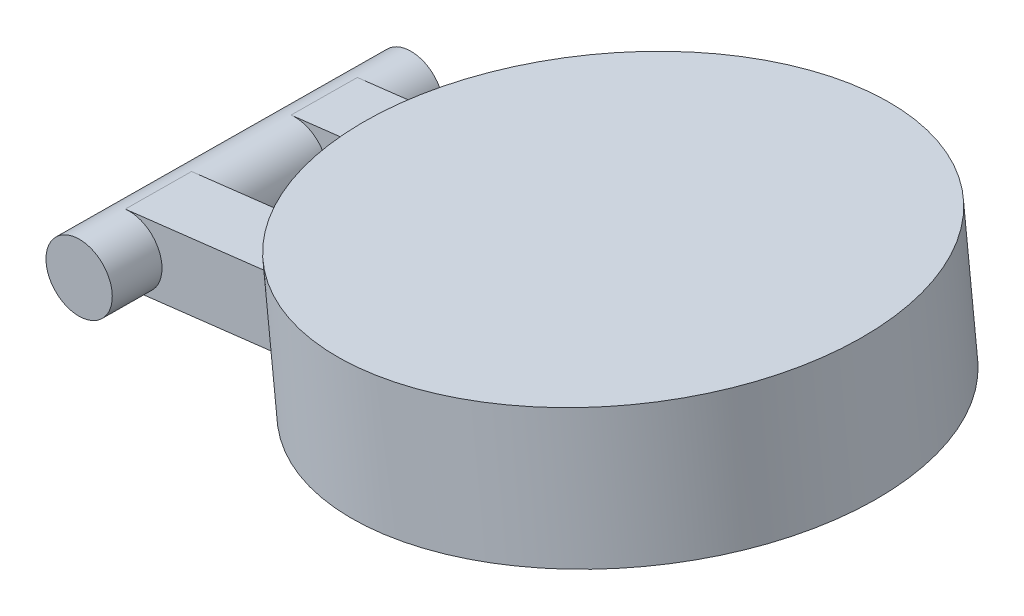
ISO-10303-21;
HEADER;
FILE_DESCRIPTION(('STEP AP214'),'2;1');
FILE_NAME('part.step','',(''),(''),'','','');
FILE_SCHEMA(('AUTOMOTIVE_DESIGN { 1 0 10303 214 1 1 1 1 }'));
ENDSEC;
DATA;
#1=APPLICATION_CONTEXT('core data for automotive mechanical design processes');
#2=APPLICATION_PROTOCOL_DEFINITION('international standard','automotive_design',2000,#1);
#3=PRODUCT_CONTEXT('',#1,'mechanical');
#4=PRODUCT('Part','Part','',(#3));
#5=PRODUCT_RELATED_PRODUCT_CATEGORY('part','',(#4));
#6=PRODUCT_DEFINITION_FORMATION('','',#4);
#7=PRODUCT_DEFINITION_CONTEXT('part definition',#1,'design');
#8=PRODUCT_DEFINITION('design','',#6,#7);
#9=PRODUCT_DEFINITION_SHAPE('','',#8);
#10=(LENGTH_UNIT() NAMED_UNIT(*) SI_UNIT(.MILLI.,.METRE.));
#11=(NAMED_UNIT(*) PLANE_ANGLE_UNIT() SI_UNIT($,.RADIAN.));
#12=(NAMED_UNIT(*) SI_UNIT($,.STERADIAN.) SOLID_ANGLE_UNIT());
#13=UNCERTAINTY_MEASURE_WITH_UNIT(LENGTH_MEASURE(1.E-05),#10,'distance_accuracy_value','');
#14=(GEOMETRIC_REPRESENTATION_CONTEXT(3) GLOBAL_UNCERTAINTY_ASSIGNED_CONTEXT((#13)) GLOBAL_UNIT_ASSIGNED_CONTEXT((#10,
#11,#12)) REPRESENTATION_CONTEXT('',''));
#15=CARTESIAN_POINT('',(0.,0.,0.));
#16=DIRECTION('',(0.,0.,1.));
#17=DIRECTION('',(1.,0.,0.));
#18=AXIS2_PLACEMENT_3D('',#15,#16,#17);
#19=CARTESIAN_POINT('',(-110.975522743951,-46.473167793621,159.397877794853));
#20=DIRECTION('',(0.116658861531535,-0.993133932766967,0.00870066738726834));
#21=DIRECTION('',(0.993171525821681,0.116663277414247,0.));
#22=AXIS2_PLACEMENT_3D('',#19,#20,#21);
#23=PLANE('',#22);
#24=DIRECTION('',(-0.993172044525099,-0.116654384890918,0.00102198804080181));
#25=VECTOR('',#24,1.);
#26=CARTESIAN_POINT('',(4.03577477931833,-32.9599778324654,159.779510360778));
#27=LINE('',#26,#25);
#28=CARTESIAN_POINT('',(-97.079984557626,-44.8366680527077,159.8835599032));
#29=VERTEX_POINT('',#28);
#30=CARTESIAN_POINT('',(-106.53392233413,-45.9470932828524,159.893288138503));
#31=VERTEX_POINT('',#30);
#32=EDGE_CURVE('E293',#29,#31,#27,.T.);
#33=ORIENTED_EDGE('',*,*,#32,.T.);
#34=CARTESIAN_POINT('',(-110.975522743951,-46.473167793621,159.397877794853));
#35=DIRECTION('',(0.116658861531535,-0.993133932766967,0.00870066738726834));
#36=DIRECTION('',(0.993171525821681,0.116663277414247,0.));
#37=AXIS2_PLACEMENT_3D('',#34,#35,#36);
#38=CIRCLE('',#37,4.50000000000001);
#39=CARTESIAN_POINT('',(-115.417123153772,-46.9904818208105,159.902429077429));
#40=VERTEX_POINT('',#39);
#41=EDGE_CURVE('E58',#31,#40,#38,.T.);
#42=ORIENTED_EDGE('',*,*,#41,.T.);
#43=CARTESIAN_POINT('',(-124.871060930276,-48.1009070509552,159.912157312733));
#44=VERTEX_POINT('',#43);
#45=EDGE_CURVE('E270',#40,#44,#27,.T.);
#46=ORIENTED_EDGE('',*,*,#45,.T.);
#47=CARTESIAN_POINT('',(-110.975522743951,-46.473167793621,159.397877794853));
#48=DIRECTION('',(0.116658861531535,-0.993133932766967,0.00870066738726834));
#49=DIRECTION('',(0.993171525821681,0.116663277414247,0.));
#50=AXIS2_PLACEMENT_3D('',#47,#48,#49);
#51=CIRCLE('',#50,14.);
#52=CARTESIAN_POINT('',(-124.300323973415,-48.0032086662417,163.411435708151));
#53=VERTEX_POINT('',#52);
#54=EDGE_CURVE('E308',#53,#44,#51,.T.);
#55=ORIENTED_EDGE('',*,*,#54,.F.);
#56=DIRECTION('',(0.9931720445251,0.116654384890918,-0.00102198804079944));
#57=VECTOR('',#56,1.);
#58=CARTESIAN_POINT('',(4.03577477931795,-32.9293161399386,163.279376052575));
#59=LINE('',#58,#57);
#60=CARTESIAN_POINT('',(-132.825307723503,-49.0045223269048,163.42020803666));
#61=VERTEX_POINT('',#60);
#62=EDGE_CURVE('E305',#61,#53,#59,.T.);
#63=ORIENTED_EDGE('',*,*,#62,.F.);
#64=DIRECTION('',(0.,-0.00876048357908495,-0.999961626227457));
#65=VECTOR('',#64,1.);
#66=CARTESIAN_POINT('',(-132.825307723503,-50.4323465338458,0.441828698298474));
#67=LINE('',#66,#65);
#68=CARTESIAN_POINT('',(-132.825307723503,-48.9870013597466,165.420131289115));
#69=VERTEX_POINT('',#68);
#70=EDGE_CURVE('E302',#69,#61,#67,.T.);
#71=ORIENTED_EDGE('',*,*,#70,.F.);
#72=DIRECTION('',(-0.9931720445251,-0.116654384890918,0.00102198804079757));
#73=VECTOR('',#72,1.);
#74=CARTESIAN_POINT('',(4.03577477931763,-32.9117951727805,165.27929930503));
#75=LINE('',#74,#73);
#76=CARTESIAN_POINT('',(-123.538265820373,-47.8961791133514,165.410574792019));
#77=VERTEX_POINT('',#76);
#78=EDGE_CURVE('E299',#77,#69,#75,.T.);
#79=ORIENTED_EDGE('',*,*,#78,.F.);
#80=CARTESIAN_POINT('',(-110.975522743951,-46.473167793621,159.397877794853));
#81=DIRECTION('',(0.116658861531535,-0.993133932766967,0.00870066738726834));
#82=DIRECTION('',(0.993171525821681,0.116663277414247,0.));
#83=AXIS2_PLACEMENT_3D('',#80,#81,#82);
#84=CIRCLE('',#83,14.);
#85=EDGE_CURVE('E296',#29,#77,#84,.T.);
#86=ORIENTED_EDGE('',*,*,#85,.F.);
#87=EDGE_LOOP('',(#33,#42,#46,#55,#63,#71,#79,#86));
#88=FACE_BOUND('',#87,.T.);
#89=DIRECTION('',(0.,0.00876048357908488,0.999961626227457));
#90=VECTOR('',#89,1.);
#91=CARTESIAN_POINT('',(-133.818479768028,-49.2963863833774,143.421997500152));
#92=LINE('',#91,#90);
#93=CARTESIAN_POINT('',(-133.818479768028,-49.2175420311657,152.421652136199));
#94=VERTEX_POINT('',#93);
#95=CARTESIAN_POINT('',(-133.818479768028,-49.1825000968493,156.421498641109));
#96=VERTEX_POINT('',#95);
#97=EDGE_CURVE('E330',#94,#96,#92,.T.);
#98=ORIENTED_EDGE('',*,*,#97,.F.);
#99=DIRECTION('',(-0.993172044525099,-0.116654384890918,0.00102198804080133));
#100=VECTOR('',#99,1.);
#101=CARTESIAN_POINT('',(4.03577477931825,-33.0256814593085,152.279798164072));
#102=LINE('',#101,#100);
#103=CARTESIAN_POINT('',(-124.151438839791,-48.0820864780061,152.411704614747));
#104=VERTEX_POINT('',#103);
#105=EDGE_CURVE('E373',#104,#94,#102,.T.);
#106=ORIENTED_EDGE('',*,*,#105,.F.);
#107=CARTESIAN_POINT('',(-110.975522743951,-46.473167793621,159.397877794853));
#108=DIRECTION('',(0.116658861531535,-0.993133932766967,0.00870066738726834));
#109=DIRECTION('',(0.993171525821681,0.116663277414247,0.));
#110=AXIS2_PLACEMENT_3D('',#107,#108,#109);
#111=CIRCLE('',#110,15.);
#112=CARTESIAN_POINT('',(-124.151438839791,-47.9594397078989,166.411167381931));
#113=VERTEX_POINT('',#112);
#114=EDGE_CURVE('E399',#104,#113,#111,.T.);
#115=ORIENTED_EDGE('',*,*,#114,.T.);
#116=DIRECTION('',(-0.9931720445251,-0.116654384890918,0.00102198804080133));
#117=VECTOR('',#116,1.);
#118=CARTESIAN_POINT('',(4.03577477931825,-32.9030346892013,166.279260931257));
#119=LINE('',#118,#117);
#120=CARTESIAN_POINT('',(-133.818479768028,-49.0948952610585,166.421114903383));
#121=VERTEX_POINT('',#120);
#122=EDGE_CURVE('E350',#113,#121,#119,.T.);
#123=ORIENTED_EDGE('',*,*,#122,.T.);
#124=CARTESIAN_POINT('',(-133.818479768028,-49.1299371953748,162.421268398473));
#125=VERTEX_POINT('',#124);
#126=EDGE_CURVE('E313',#125,#121,#92,.T.);
#127=ORIENTED_EDGE('',*,*,#126,.F.);
#128=DIRECTION('',(-0.9931720445251,-0.116654384890918,0.00102198804080133));
#129=VECTOR('',#128,1.);
#130=CARTESIAN_POINT('',(4.03577477931825,-32.9380766235177,162.279414426347));
#131=LINE('',#130,#129);
#132=CARTESIAN_POINT('',(-125.572111159251,-48.1613486583296,162.412782768874));
#133=VERTEX_POINT('',#132);
#134=EDGE_CURVE('E355',#133,#125,#131,.T.);
#135=ORIENTED_EDGE('',*,*,#134,.F.);
#136=CARTESIAN_POINT('',(-125.572111159251,-48.2139115598041,156.413013011509));
#137=VERTEX_POINT('',#136);
#138=EDGE_CURVE('E402',#133,#137,#111,.T.);
#139=ORIENTED_EDGE('',*,*,#138,.T.);
#140=DIRECTION('',(-0.9931720445251,-0.116654384890918,0.00102198804080133));
#141=VECTOR('',#140,1.);
#142=CARTESIAN_POINT('',(4.03577477931825,-32.9906395249922,156.279644668982));
#143=LINE('',#142,#141);
#144=EDGE_CURVE('E368',#137,#96,#143,.T.);
#145=ORIENTED_EDGE('',*,*,#144,.T.);
#146=EDGE_LOOP('',(#98,#106,#115,#123,#127,#135,#139,#145));
#147=FACE_BOUND('',#146,.T.);
#148=CARTESIAN_POINT('',(-110.975522743951,-46.473167793621,159.397877794853));
#149=DIRECTION('',(0.116658861531535,-0.993133932766967,0.00870066738726834));
#150=DIRECTION('',(0.993171525821681,0.116663277414247,0.));
#151=AXIS2_PLACEMENT_3D('',#148,#149,#150);
#152=CIRCLE('',#151,4.00000000000001);
#153=CARTESIAN_POINT('',(-107.002836640665,-46.006514683964,159.397877794853));
#154=VERTEX_POINT('',#153);
#155=EDGE_CURVE('E392',#154,#154,#152,.T.);
#156=ORIENTED_EDGE('',*,*,#155,.F.);
#157=EDGE_LOOP('',(#156));
#158=FACE_BOUND('',#157,.T.);
#159=DIRECTION('',(-0.9931720445251,-0.116654384890918,0.00102198804080181));
#160=VECTOR('',#159,1.);
#161=CARTESIAN_POINT('',(4.03577477931833,-32.9687383160444,158.779548734551));
#162=LINE('',#161,#160);
#163=CARTESIAN_POINT('',(-115.417123153772,-46.9992423043896,158.902467451202));
#164=VERTEX_POINT('',#163);
#165=CARTESIAN_POINT('',(-124.871060930276,-48.1096675345343,158.912195686505));
#166=VERTEX_POINT('',#165);
#167=EDGE_CURVE('E236',#164,#166,#162,.T.);
#168=ORIENTED_EDGE('',*,*,#167,.F.);
#169=CARTESIAN_POINT('',(-110.975522743951,-46.473167793621,159.397877794853));
#170=DIRECTION('',(0.116658861531535,-0.993133932766967,0.00870066738726834));
#171=DIRECTION('',(0.993171525821681,0.116663277414247,0.));
#172=AXIS2_PLACEMENT_3D('',#169,#170,#171);
#173=CIRCLE('',#172,4.50000000000001);
#174=CARTESIAN_POINT('',(-106.53392233413,-45.9558537664315,158.893326512276));
#175=VERTEX_POINT('',#174);
#176=EDGE_CURVE('E50',#164,#175,#173,.T.);
#177=ORIENTED_EDGE('',*,*,#176,.T.);
#178=CARTESIAN_POINT('',(-97.079984557626,-44.8454285362868,158.883598276972));
#179=VERTEX_POINT('',#178);
#180=EDGE_CURVE('E216',#179,#175,#162,.T.);
#181=ORIENTED_EDGE('',*,*,#180,.F.);
#182=CARTESIAN_POINT('',(-110.975522743951,-46.473167793621,159.397877794853));
#183=DIRECTION('',(0.116658861531535,-0.993133932766967,0.00870066738726834));
#184=DIRECTION('',(0.993171525821681,0.116663277414247,0.));
#185=AXIS2_PLACEMENT_3D('',#182,#183,#184);
#186=CIRCLE('',#185,14.);
#187=CARTESIAN_POINT('',(-123.538265820373,-48.0013049163004,153.411035277289));
#188=VERTEX_POINT('',#187);
#189=EDGE_CURVE('E250',#188,#179,#186,.T.);
#190=ORIENTED_EDGE('',*,*,#189,.F.);
#191=DIRECTION('',(0.9931720445251,0.116654384890918,-0.00102198804080053));
#192=VECTOR('',#191,1.);
#193=CARTESIAN_POINT('',(4.03577477931813,-33.0169209757294,153.2797597903));
#194=LINE('',#193,#192);
#195=CARTESIAN_POINT('',(-132.825307723503,-49.0921271626957,153.420591774385));
#196=VERTEX_POINT('',#195);
#197=EDGE_CURVE('E247',#196,#188,#194,.T.);
#198=ORIENTED_EDGE('',*,*,#197,.F.);
#199=DIRECTION('',(0.,-0.0087604835790849,-0.999961626227457));
#200=VECTOR('',#199,1.);
#201=CARTESIAN_POINT('',(-132.825307723503,-50.4323465338458,0.441828698298418));
#202=LINE('',#201,#200);
#203=CARTESIAN_POINT('',(-132.825307723503,-49.0746061955375,155.42051502684));
#204=VERTEX_POINT('',#203);
#205=EDGE_CURVE('E244',#204,#196,#202,.T.);
#206=ORIENTED_EDGE('',*,*,#205,.F.);
#207=DIRECTION('',(-0.9931720445251,-0.116654384890918,0.00102198804079944));
#208=VECTOR('',#207,1.);
#209=CARTESIAN_POINT('',(4.03577477931796,-32.9994000085713,155.279683042755));
#210=LINE('',#209,#208);
#211=CARTESIAN_POINT('',(-124.300323973415,-48.0732925348744,155.411742698331));
#212=VERTEX_POINT('',#211);
#213=EDGE_CURVE('E241',#212,#204,#210,.T.);
#214=ORIENTED_EDGE('',*,*,#213,.F.);
#215=CARTESIAN_POINT('',(-110.975522743951,-46.473167793621,159.397877794853));
#216=DIRECTION('',(0.116658861531535,-0.993133932766967,0.00870066738726834));
#217=DIRECTION('',(0.993171525821681,0.116663277414247,0.));
#218=AXIS2_PLACEMENT_3D('',#215,#216,#217);
#219=CIRCLE('',#218,14.);
#220=EDGE_CURVE('E238',#166,#212,#219,.T.);
#221=ORIENTED_EDGE('',*,*,#220,.F.);
#222=EDGE_LOOP('',(#168,#177,#181,#190,#198,#206,#214,#221));
#223=FACE_BOUND('',#222,.T.);
#224=ADVANCED_FACE('F35',(#88,#147,#158,#223),#23,.T.);
#225=CARTESIAN_POINT('',(3.56913933319211,-29.0181037939243,156.244841999433));
#226=DIRECTION('',(0.,0.00876048357908488,0.999961626227457));
#227=DIRECTION('',(0.,-0.999961626227457,0.00876048357908488));
#228=AXIS2_PLACEMENT_3D('',#225,#226,#227);
#229=PLANE('',#228);
#230=CARTESIAN_POINT('',(-134.051797491091,-47.1962322313154,156.404097306334));
#231=DIRECTION('',(0.,0.00876048357908488,0.999961626227457));
#232=DIRECTION('',(0.,-0.999961626227457,0.00876048357908488));
#233=AXIS2_PLACEMENT_3D('',#230,#231,#232);
#234=CIRCLE('',#233,1.99999999999999);
#235=CARTESIAN_POINT('',(-134.285115214155,-45.2099643657815,156.38669597156));
#236=VERTEX_POINT('',#235);
#237=EDGE_CURVE('E347',#96,#236,#234,.T.);
#238=ORIENTED_EDGE('',*,*,#237,.F.);
#239=ORIENTED_EDGE('',*,*,#144,.F.);
#240=DIRECTION('',(-0.116658861531535,0.993133932766967,-0.00870066738726834));
#241=VECTOR('',#240,1.);
#242=CARTESIAN_POINT('',(-125.572111159251,-48.2139115598041,156.413013011509));
#243=LINE('',#242,#241);
#244=CARTESIAN_POINT('',(-126.038746605377,-44.2413758287363,156.37821034196));
#245=VERTEX_POINT('',#244);
#246=EDGE_CURVE('E383',#245,#137,#243,.F.);
#247=ORIENTED_EDGE('',*,*,#246,.F.);
#248=DIRECTION('',(-0.9931720445251,-0.116654384890918,0.00102198804080133));
#249=VECTOR('',#248,1.);
#250=CARTESIAN_POINT('',(3.56913933319211,-29.0181037939243,156.244841999433));
#251=LINE('',#250,#249);
#252=EDGE_CURVE('E369',#245,#236,#251,.T.);
#253=ORIENTED_EDGE('',*,*,#252,.T.);
#254=EDGE_LOOP('',(#238,#239,#247,#253));
#255=FACE_BOUND('',#254,.T.);
#256=ADVANCED_FACE('F426',(#255),#229,.T.);
#257=CARTESIAN_POINT('',(3.56913933319211,-29.0531457282406,152.244995494523));
#258=DIRECTION('',(0.,0.00876048357908488,0.999961626227457));
#259=DIRECTION('',(0.,-0.999961626227457,0.00876048357908488));
#260=AXIS2_PLACEMENT_3D('',#257,#258,#259);
#261=PLANE('',#260);
#262=ORIENTED_EDGE('',*,*,#105,.T.);
#263=CARTESIAN_POINT('',(-134.051797491091,-47.2312741656317,152.404250801424));
#264=DIRECTION('',(0.,0.00876048357908488,0.999961626227457));
#265=DIRECTION('',(0.,-0.999961626227457,0.00876048357908488));
#266=AXIS2_PLACEMENT_3D('',#263,#264,#265);
#267=CIRCLE('',#266,1.99999999999999);
#268=CARTESIAN_POINT('',(-134.285115214155,-45.2450063000978,152.38684946665));
#269=VERTEX_POINT('',#268);
#270=EDGE_CURVE('E344',#94,#269,#267,.T.);
#271=ORIENTED_EDGE('',*,*,#270,.T.);
#272=DIRECTION('',(-0.993172044525099,-0.116654384890918,0.00102198804080133));
#273=VECTOR('',#272,1.);
#274=CARTESIAN_POINT('',(3.56913933319211,-29.0531457282406,152.244995494523));
#275=LINE('',#274,#273);
#276=CARTESIAN_POINT('',(-124.618074285917,-44.1095507469382,152.376901945198));
#277=VERTEX_POINT('',#276);
#278=EDGE_CURVE('E372',#277,#269,#275,.T.);
#279=ORIENTED_EDGE('',*,*,#278,.F.);
#280=DIRECTION('',(-0.116658861531535,0.993133932766967,-0.00870066738726834));
#281=VECTOR('',#280,1.);
#282=CARTESIAN_POINT('',(-124.151438839791,-48.0820864780061,152.411704614747));
#283=LINE('',#282,#281);
#284=EDGE_CURVE('E376',#277,#104,#283,.F.);
#285=ORIENTED_EDGE('',*,*,#284,.T.);
#286=EDGE_LOOP('',(#262,#271,#279,#285));
#287=FACE_BOUND('',#286,.T.);
#288=ADVANCED_FACE('F412',(#287),#261,.F.);
#289=CARTESIAN_POINT('',(3.56913933319211,-28.9304989581335,166.244458261708));
#290=DIRECTION('',(0.,0.00876048357908488,0.999961626227457));
#291=DIRECTION('',(0.,-0.999961626227457,0.00876048357908488));
#292=AXIS2_PLACEMENT_3D('',#289,#290,#291);
#293=PLANE('',#292);
#294=CARTESIAN_POINT('',(-134.051797491091,-47.1086273955246,166.403713568609));
#295=DIRECTION('',(0.,0.00876048357908488,0.999961626227457));
#296=DIRECTION('',(0.,-0.999961626227457,0.00876048357908488));
#297=AXIS2_PLACEMENT_3D('',#294,#295,#296);
#298=CIRCLE('',#297,1.99999999999999);
#299=CARTESIAN_POINT('',(-134.285115214155,-45.1223595299906,166.386312233834));
#300=VERTEX_POINT('',#299);
#301=EDGE_CURVE('E341',#121,#300,#298,.T.);
#302=ORIENTED_EDGE('',*,*,#301,.F.);
#303=ORIENTED_EDGE('',*,*,#122,.F.);
#304=DIRECTION('',(-0.116658861531535,0.993133932766967,-0.00870066738726834));
#305=VECTOR('',#304,1.);
#306=CARTESIAN_POINT('',(-124.151438839791,-47.9594397078989,166.411167381931));
#307=LINE('',#306,#305);
#308=CARTESIAN_POINT('',(-124.618074285917,-43.986903976831,166.376364712382));
#309=VERTEX_POINT('',#308);
#310=EDGE_CURVE('E365',#309,#113,#307,.F.);
#311=ORIENTED_EDGE('',*,*,#310,.F.);
#312=DIRECTION('',(-0.9931720445251,-0.116654384890918,0.00102198804080133));
#313=VECTOR('',#312,1.);
#314=CARTESIAN_POINT('',(3.56913933319211,-28.9304989581335,166.244458261708));
#315=LINE('',#314,#313);
#316=EDGE_CURVE('E351',#309,#300,#315,.T.);
#317=ORIENTED_EDGE('',*,*,#316,.T.);
#318=EDGE_LOOP('',(#302,#303,#311,#317));
#319=FACE_BOUND('',#318,.T.);
#320=ADVANCED_FACE('F437',(#319),#293,.T.);
#321=CARTESIAN_POINT('',(3.56913933319211,-28.9655408924498,162.244611756798));
#322=DIRECTION('',(0.,0.00876048357908488,0.999961626227457));
#323=DIRECTION('',(0.,-0.999961626227457,0.00876048357908488));
#324=AXIS2_PLACEMENT_3D('',#321,#322,#323);
#325=PLANE('',#324);
#326=ORIENTED_EDGE('',*,*,#134,.T.);
#327=CARTESIAN_POINT('',(-134.051797491091,-47.1436693298409,162.403867063699));
#328=DIRECTION('',(0.,0.00876048357908488,0.999961626227457));
#329=DIRECTION('',(0.,-0.999961626227457,0.00876048357908488));
#330=AXIS2_PLACEMENT_3D('',#327,#328,#329);
#331=CIRCLE('',#330,1.99999999999999);
#332=CARTESIAN_POINT('',(-134.285115214155,-45.157401464307,162.386465728924));
#333=VERTEX_POINT('',#332);
#334=EDGE_CURVE('E338',#125,#333,#331,.T.);
#335=ORIENTED_EDGE('',*,*,#334,.T.);
#336=DIRECTION('',(-0.9931720445251,-0.116654384890918,0.00102198804080133));
#337=VECTOR('',#336,1.);
#338=CARTESIAN_POINT('',(3.56913933319211,-28.9655408924498,162.244611756798));
#339=LINE('',#338,#337);
#340=CARTESIAN_POINT('',(-126.038746605377,-44.1888129272618,162.377980099325));
#341=VERTEX_POINT('',#340);
#342=EDGE_CURVE('E354',#341,#333,#339,.T.);
#343=ORIENTED_EDGE('',*,*,#342,.F.);
#344=DIRECTION('',(-0.116658861531535,0.993133932766967,-0.00870066738726834));
#345=VECTOR('',#344,1.);
#346=CARTESIAN_POINT('',(-125.572111159251,-48.1613486583296,162.412782768874));
#347=LINE('',#346,#345);
#348=EDGE_CURVE('E358',#341,#133,#347,.F.);
#349=ORIENTED_EDGE('',*,*,#348,.T.);
#350=EDGE_LOOP('',(#326,#335,#343,#349));
#351=FACE_BOUND('',#350,.T.);
#352=ADVANCED_FACE('F432',(#351),#325,.F.);
#353=CARTESIAN_POINT('',(-110.975522743951,-46.473167793621,159.397877794853));
#354=DIRECTION('',(-0.116658861531535,0.993133932766967,-0.00870066738726834));
#355=DIRECTION('',(-0.993171525821681,-0.116663277414247,0.));
#356=AXIS2_PLACEMENT_3D('',#353,#354,#355);
#357=CYLINDRICAL_SURFACE('',#356,15.);
#358=CARTESIAN_POINT('',(-111.442158190077,-42.5006320625531,159.363075125304));
#359=DIRECTION('',(0.116658861531535,-0.993133932766967,0.00870066738726834));
#360=DIRECTION('',(0.993171525821681,0.116663277414247,0.));
#361=AXIS2_PLACEMENT_3D('',#358,#359,#360);
#362=CIRCLE('',#361,15.);
#363=EDGE_CURVE('E11',#309,#341,#362,.T.);
#364=ORIENTED_EDGE('',*,*,#363,.F.);
#365=ORIENTED_EDGE('',*,*,#310,.T.);
#366=ORIENTED_EDGE('',*,*,#114,.F.);
#367=ORIENTED_EDGE('',*,*,#284,.F.);
#368=CARTESIAN_POINT('',(-111.442158190077,-42.5006320625531,159.363075125304));
#369=DIRECTION('',(0.116658861531535,-0.993133932766967,0.00870066738726834));
#370=DIRECTION('',(0.993171525821681,0.116663277414247,0.));
#371=AXIS2_PLACEMENT_3D('',#368,#369,#370);
#372=CIRCLE('',#371,15.);
#373=EDGE_CURVE('E43',#245,#277,#372,.T.);
#374=ORIENTED_EDGE('',*,*,#373,.F.);
#375=ORIENTED_EDGE('',*,*,#246,.T.);
#376=ORIENTED_EDGE('',*,*,#138,.F.);
#377=ORIENTED_EDGE('',*,*,#348,.F.);
#378=EDGE_LOOP('',(#364,#365,#366,#367,#374,#375,#376,#377));
#379=FACE_BOUND('',#378,.T.);
#380=CARTESIAN_POINT('',(-111.908793636203,-38.5280963314852,159.328272455754));
#381=DIRECTION('',(0.116658861531535,-0.993133932766967,0.00870066738726834));
#382=DIRECTION('',(0.993171525821681,0.116663277414247,0.));
#383=AXIS2_PLACEMENT_3D('',#380,#381,#382);
#384=CIRCLE('',#383,15.);
#385=CARTESIAN_POINT('',(-97.0112207488783,-36.7781471702715,159.328272455754));
#386=VERTEX_POINT('',#385);
#387=EDGE_CURVE('E396',#386,#386,#384,.T.);
#388=ORIENTED_EDGE('',*,*,#387,.T.);
#389=EDGE_LOOP('',(#388));
#390=FACE_BOUND('',#389,.T.);
#391=ADVANCED_FACE('F37',(#379,#390),#357,.T.);
#392=CARTESIAN_POINT('',(-111.908793636203,-38.5280963314852,159.328272455754));
#393=DIRECTION('',(0.116658861531535,-0.993133932766967,0.00870066738726834));
#394=DIRECTION('',(0.993171525821681,0.116663277414247,0.));
#395=AXIS2_PLACEMENT_3D('',#392,#393,#394);
#396=PLANE('',#395);
#397=ORIENTED_EDGE('',*,*,#387,.F.);
#398=EDGE_LOOP('',(#397));
#399=FACE_BOUND('',#398,.T.);
#400=ADVANCED_FACE('F464',(#399),#396,.F.);
#401=CARTESIAN_POINT('',(-111.325499328546,-43.4937659953201,159.371775792691));
#402=DIRECTION('',(0.116658861531535,-0.993133932766967,0.00870066738726834));
#403=DIRECTION('',(0.993171525821681,0.116663277414247,0.));
#404=AXIS2_PLACEMENT_3D('',#401,#402,#403);
#405=CYLINDRICAL_SURFACE('',#404,4.00000000000001);
#406=CARTESIAN_POINT('',(-111.325499328546,-43.4937659953201,159.371775792691));
#407=DIRECTION('',(0.116658861531535,-0.993133932766967,0.00870066738726834));
#408=DIRECTION('',(0.993171525821681,0.116663277414247,0.));
#409=AXIS2_PLACEMENT_3D('',#406,#407,#408);
#410=CIRCLE('',#409,4.00000000000001);
#411=CARTESIAN_POINT('',(-107.352813225259,-43.0271128856631,159.371775792691));
#412=VERTEX_POINT('',#411);
#413=EDGE_CURVE('E393',#412,#412,#410,.T.);
#414=ORIENTED_EDGE('',*,*,#413,.F.);
#415=EDGE_LOOP('',(#414));
#416=FACE_BOUND('',#415,.T.);
#417=ORIENTED_EDGE('',*,*,#155,.T.);
#418=EDGE_LOOP('',(#417));
#419=FACE_BOUND('',#418,.T.);
#420=ADVANCED_FACE('F462',(#416,#419),#405,.F.);
#421=CARTESIAN_POINT('',(-111.325499328546,-43.4937659953201,159.371775792691));
#422=DIRECTION('',(0.116658861531535,-0.993133932766967,0.00870066738726834));
#423=DIRECTION('',(0.993171525821681,0.116663277414247,0.));
#424=AXIS2_PLACEMENT_3D('',#421,#422,#423);
#425=PLANE('',#424);
#426=ORIENTED_EDGE('',*,*,#413,.T.);
#427=EDGE_LOOP('',(#426));
#428=FACE_BOUND('',#427,.T.);
#429=ADVANCED_FACE('F471',(#428),#425,.T.);
#430=CARTESIAN_POINT('',(3.56913933319218,-30.3846046158116,0.266194044663528));
#431=DIRECTION('',(0.116658861531535,-0.993133932766967,0.00870066738726834));
#432=DIRECTION('',(0.993171525821681,0.116663277414247,0.));
#433=AXIS2_PLACEMENT_3D('',#430,#431,#432);
#434=PLANE('',#433);
#435=ORIENTED_EDGE('',*,*,#278,.T.);
#436=DIRECTION('',(0.,0.00876048357908488,0.999961626227457));
#437=VECTOR('',#436,1.);
#438=CARTESIAN_POINT('',(-134.285115214155,-45.3238506523096,143.387194830603));
#439=LINE('',#438,#437);
#440=EDGE_CURVE('E329',#269,#236,#439,.T.);
#441=ORIENTED_EDGE('',*,*,#440,.T.);
#442=ORIENTED_EDGE('',*,*,#252,.F.);
#443=ORIENTED_EDGE('',*,*,#373,.T.);
#444=EDGE_LOOP('',(#435,#441,#442,#443));
#445=FACE_BOUND('',#444,.T.);
#446=ADVANCED_FACE('F408',(#445),#434,.F.);
#447=CARTESIAN_POINT('',(3.56913933319218,-30.3846046158116,0.266194044663528));
#448=DIRECTION('',(0.116658861531535,-0.993133932766967,0.00870066738726834));
#449=DIRECTION('',(0.993171525821681,0.116663277414247,0.));
#450=AXIS2_PLACEMENT_3D('',#447,#448,#449);
#451=PLANE('',#450);
#452=ORIENTED_EDGE('',*,*,#342,.T.);
#453=EDGE_CURVE('E327',#333,#300,#439,.T.);
#454=ORIENTED_EDGE('',*,*,#453,.T.);
#455=ORIENTED_EDGE('',*,*,#316,.F.);
#456=ORIENTED_EDGE('',*,*,#363,.T.);
#457=EDGE_LOOP('',(#452,#454,#455,#456));
#458=FACE_BOUND('',#457,.T.);
#459=ADVANCED_FACE('F434',(#458),#451,.F.);
#460=CARTESIAN_POINT('',(-134.051797491091,-47.0823459447873,169.403598447291));
#461=DIRECTION('',(0.,0.00876048357908488,0.999961626227457));
#462=DIRECTION('',(0.,-0.999961626227457,0.00876048357908488));
#463=AXIS2_PLACEMENT_3D('',#460,#461,#462);
#464=PLANE('',#463);
#465=CARTESIAN_POINT('',(-134.051797491091,-47.0823459447873,169.403598447291));
#466=DIRECTION('',(0.,0.00876048357908488,0.999961626227457));
#467=DIRECTION('',(0.,-0.999961626227457,0.00876048357908488));
#468=AXIS2_PLACEMENT_3D('',#465,#466,#467);
#469=CIRCLE('',#468,1.99999999999999);
#470=CARTESIAN_POINT('',(-134.051797491091,-49.0822691972422,169.421119414449));
#471=VERTEX_POINT('',#470);
#472=EDGE_CURVE('E332',#471,#471,#469,.T.);
#473=ORIENTED_EDGE('',*,*,#472,.T.);
#474=EDGE_LOOP('',(#473));
#475=FACE_BOUND('',#474,.T.);
#476=ADVANCED_FACE('F442',(#475),#464,.T.);
#477=CARTESIAN_POINT('',(-134.051797491091,-47.257555616369,149.404365922742));
#478=DIRECTION('',(0.,0.00876048357908488,0.999961626227457));
#479=DIRECTION('',(0.,-0.999961626227457,0.00876048357908488));
#480=AXIS2_PLACEMENT_3D('',#477,#478,#479);
#481=CYLINDRICAL_SURFACE('',#480,1.99999999999999);
#482=ORIENTED_EDGE('',*,*,#270,.F.);
#483=ORIENTED_EDGE('',*,*,#97,.T.);
#484=ORIENTED_EDGE('',*,*,#237,.T.);
#485=ORIENTED_EDGE('',*,*,#440,.F.);
#486=EDGE_LOOP('',(#482,#483,#484,#485));
#487=FACE_BOUND('',#486,.T.);
#488=CARTESIAN_POINT('',(-134.051797491091,-47.257555616369,149.404365922742));
#489=DIRECTION('',(0.,0.00876048357908488,0.999961626227457));
#490=DIRECTION('',(0.,-0.999961626227457,0.00876048357908488));
#491=AXIS2_PLACEMENT_3D('',#488,#489,#490);
#492=CIRCLE('',#491,1.99999999999999);
#493=CARTESIAN_POINT('',(-134.051797491091,-49.2574788688239,149.4218868899));
#494=VERTEX_POINT('',#493);
#495=EDGE_CURVE('E335',#494,#494,#492,.T.);
#496=ORIENTED_EDGE('',*,*,#495,.T.);
#497=EDGE_LOOP('',(#496));
#498=FACE_BOUND('',#497,.T.);
#499=ORIENTED_EDGE('',*,*,#334,.F.);
#500=ORIENTED_EDGE('',*,*,#126,.T.);
#501=ORIENTED_EDGE('',*,*,#301,.T.);
#502=ORIENTED_EDGE('',*,*,#453,.F.);
#503=EDGE_LOOP('',(#499,#500,#501,#502));
#504=FACE_BOUND('',#503,.T.);
#505=ORIENTED_EDGE('',*,*,#472,.F.);
#506=EDGE_LOOP('',(#505));
#507=FACE_BOUND('',#506,.T.);
#508=ADVANCED_FACE('F423',(#487,#498,#504,#507),#481,.T.);
#509=CARTESIAN_POINT('',(-134.051797491091,-47.257555616369,149.404365922742));
#510=DIRECTION('',(0.,0.00876048357908488,0.999961626227457));
#511=DIRECTION('',(0.,-0.999961626227457,0.00876048357908488));
#512=AXIS2_PLACEMENT_3D('',#509,#510,#511);
#513=PLANE('',#512);
#514=ORIENTED_EDGE('',*,*,#495,.F.);
#515=EDGE_LOOP('',(#514));
#516=FACE_BOUND('',#515,.T.);
#517=ADVANCED_FACE('F441',(#516),#513,.F.);
#518=CARTESIAN_POINT('',(-111.033852174717,-45.9766008272375,159.393527461159));
#519=DIRECTION('',(0.116658861531535,-0.993133932766967,0.00870066738726834));
#520=DIRECTION('',(0.993171525821681,0.116663277414247,0.));
#521=AXIS2_PLACEMENT_3D('',#518,#519,#520);
#522=CYLINDRICAL_SURFACE('',#521,4.50000000000001);
#523=ORIENTED_EDGE('',*,*,#41,.F.);
#524=DIRECTION('',(0.116658861531535,-0.993133932766967,0.00870066738726834));
#525=VECTOR('',#524,1.);
#526=CARTESIAN_POINT('',(-106.592251764896,-45.4505263164689,159.88893780481));
#527=LINE('',#526,#525);
#528=CARTESIAN_POINT('',(-106.592251764896,-45.4505263164689,159.88893780481));
#529=VERTEX_POINT('',#528);
#530=EDGE_CURVE('E291',#529,#31,#527,.T.);
#531=ORIENTED_EDGE('',*,*,#530,.F.);
#532=CARTESIAN_POINT('',(-111.033852174717,-45.9766008272375,159.393527461159));
#533=DIRECTION('',(0.116658861531535,-0.993133932766967,0.00870066738726834));
#534=DIRECTION('',(0.993171525821681,0.116663277414247,0.));
#535=AXIS2_PLACEMENT_3D('',#532,#533,#534);
#536=CIRCLE('',#535,4.50000000000001);
#537=CARTESIAN_POINT('',(-115.475452584538,-46.493914854427,159.898078743736));
#538=VERTEX_POINT('',#537);
#539=EDGE_CURVE('E266',#529,#538,#536,.T.);
#540=ORIENTED_EDGE('',*,*,#539,.T.);
#541=DIRECTION('',(0.116658861531535,-0.993133932766967,0.00870066738726834));
#542=VECTOR('',#541,1.);
#543=CARTESIAN_POINT('',(-115.475452584538,-46.493914854427,159.898078743736));
#544=LINE('',#543,#542);
#545=EDGE_CURVE('E311',#538,#40,#544,.T.);
#546=ORIENTED_EDGE('',*,*,#545,.T.);
#547=EDGE_LOOP('',(#523,#531,#540,#546));
#548=FACE_BOUND('',#547,.T.);
#549=ADVANCED_FACE('F565',(#548),#522,.T.);
#550=CARTESIAN_POINT('',(3.97744534855256,-32.4634108660819,159.775160027084));
#551=DIRECTION('',(0.,0.00876048357908494,0.999961626227457));
#552=DIRECTION('',(0.,-0.999961626227457,0.00876048357908494));
#553=AXIS2_PLACEMENT_3D('',#550,#551,#552);
#554=PLANE('',#553);
#555=ORIENTED_EDGE('',*,*,#45,.F.);
#556=ORIENTED_EDGE('',*,*,#545,.F.);
#557=DIRECTION('',(-0.993172044525099,-0.116654384890918,0.00102198804080181));
#558=VECTOR('',#557,1.);
#559=CARTESIAN_POINT('',(3.97744534855256,-32.4634108660819,159.775160027084));
#560=LINE('',#559,#558);
#561=CARTESIAN_POINT('',(-124.929390361042,-47.6043400845717,159.907806979039));
#562=VERTEX_POINT('',#561);
#563=EDGE_CURVE('E273',#538,#562,#560,.T.);
#564=ORIENTED_EDGE('',*,*,#563,.T.);
#565=DIRECTION('',(0.116658861531535,-0.993133932766967,0.00870066738726834));
#566=VECTOR('',#565,1.);
#567=CARTESIAN_POINT('',(-124.929390361042,-47.6043400845717,159.907806979039));
#568=LINE('',#567,#566);
#569=EDGE_CURVE('E314',#562,#44,#568,.T.);
#570=ORIENTED_EDGE('',*,*,#569,.T.);
#571=EDGE_LOOP('',(#555,#556,#564,#570));
#572=FACE_BOUND('',#571,.T.);
#573=ADVANCED_FACE('F561',(#572),#554,.T.);
#574=CARTESIAN_POINT('',(-111.033852174717,-45.9766008272375,159.393527461159));
#575=DIRECTION('',(0.116658861531535,-0.993133932766967,0.00870066738726834));
#576=DIRECTION('',(0.993171525821681,0.116663277414247,0.));
#577=AXIS2_PLACEMENT_3D('',#574,#575,#576);
#578=CYLINDRICAL_SURFACE('',#577,14.);
#579=ORIENTED_EDGE('',*,*,#54,.T.);
#580=ORIENTED_EDGE('',*,*,#569,.F.);
#581=CARTESIAN_POINT('',(-111.033852174717,-45.9766008272375,159.393527461159));
#582=DIRECTION('',(0.116658861531535,-0.993133932766967,0.00870066738726834));
#583=DIRECTION('',(0.993171525821681,0.116663277414247,0.));
#584=AXIS2_PLACEMENT_3D('',#581,#582,#583);
#585=CIRCLE('',#584,14.);
#586=CARTESIAN_POINT('',(-124.35865340418,-47.5066416998583,163.407085374457));
#587=VERTEX_POINT('',#586);
#588=EDGE_CURVE('E285',#587,#562,#585,.T.);
#589=ORIENTED_EDGE('',*,*,#588,.F.);
#590=DIRECTION('',(0.116658861531535,-0.993133932766967,0.00870066738726834));
#591=VECTOR('',#590,1.);
#592=CARTESIAN_POINT('',(-124.35865340418,-47.5066416998583,163.407085374457));
#593=LINE('',#592,#591);
#594=EDGE_CURVE('E316',#587,#53,#593,.T.);
#595=ORIENTED_EDGE('',*,*,#594,.T.);
#596=EDGE_LOOP('',(#579,#580,#589,#595));
#597=FACE_BOUND('',#596,.T.);
#598=ADVANCED_FACE('F564',(#597),#578,.F.);
#599=CARTESIAN_POINT('',(3.97744534855218,-32.4327491735551,163.275025718881));
#600=DIRECTION('',(0.,-0.00876048357908466,-0.999961626227457));
#601=DIRECTION('',(0.,0.999961626227457,-0.00876048357908466));
#602=AXIS2_PLACEMENT_3D('',#599,#600,#601);
#603=PLANE('',#602);
#604=ORIENTED_EDGE('',*,*,#62,.T.);
#605=ORIENTED_EDGE('',*,*,#594,.F.);
#606=DIRECTION('',(0.9931720445251,0.116654384890918,-0.00102198804079944));
#607=VECTOR('',#606,1.);
#608=CARTESIAN_POINT('',(3.97744534855218,-32.4327491735551,163.275025718881));
#609=LINE('',#608,#607);
#610=CARTESIAN_POINT('',(-132.883637154269,-48.5079553605213,163.415857702966));
#611=VERTEX_POINT('',#610);
#612=EDGE_CURVE('E282',#611,#587,#609,.T.);
#613=ORIENTED_EDGE('',*,*,#612,.F.);
#614=DIRECTION('',(0.116658861531535,-0.993133932766967,0.00870066738726834));
#615=VECTOR('',#614,1.);
#616=CARTESIAN_POINT('',(-132.883637154269,-48.5079553605213,163.415857702966));
#617=LINE('',#616,#615);
#618=EDGE_CURVE('E318',#611,#61,#617,.T.);
#619=ORIENTED_EDGE('',*,*,#618,.T.);
#620=EDGE_LOOP('',(#604,#605,#613,#619));
#621=FACE_BOUND('',#620,.T.);
#622=ADVANCED_FACE('F569',(#621),#603,.F.);
#623=CARTESIAN_POINT('',(-132.883637154269,-49.9357795674623,0.43747836460484));
#624=DIRECTION('',(-0.993172044525099,-0.116654384890918,0.00102198804080195));
#625=DIRECTION('',(0.116654445811359,-0.993172563189522,0.));
#626=AXIS2_PLACEMENT_3D('',#623,#624,#625);
#627=PLANE('',#626);
#628=ORIENTED_EDGE('',*,*,#70,.T.);
#629=ORIENTED_EDGE('',*,*,#618,.F.);
#630=DIRECTION('',(0.,-0.00876048357908495,-0.999961626227457));
#631=VECTOR('',#630,1.);
#632=CARTESIAN_POINT('',(-132.883637154269,-49.9357795674623,0.43747836460484));
#633=LINE('',#632,#631);
#634=CARTESIAN_POINT('',(-132.883637154269,-48.4904343933632,165.415780955421));
#635=VERTEX_POINT('',#634);
#636=EDGE_CURVE('E279',#635,#611,#633,.T.);
#637=ORIENTED_EDGE('',*,*,#636,.F.);
#638=DIRECTION('',(0.116658861531535,-0.993133932766967,0.00870066738726834));
#639=VECTOR('',#638,1.);
#640=CARTESIAN_POINT('',(-132.883637154269,-48.4904343933632,165.415780955421));
#641=LINE('',#640,#639);
#642=EDGE_CURVE('E320',#635,#69,#641,.T.);
#643=ORIENTED_EDGE('',*,*,#642,.T.);
#644=EDGE_LOOP('',(#628,#629,#637,#643));
#645=FACE_BOUND('',#644,.T.);
#646=ADVANCED_FACE('F573',(#645),#627,.F.);
#647=CARTESIAN_POINT('',(3.97744534855187,-32.415228206397,165.274948971336));
#648=DIRECTION('',(0.,0.00876048357908444,0.999961626227457));
#649=DIRECTION('',(0.,-0.999961626227457,0.00876048357908444));
#650=AXIS2_PLACEMENT_3D('',#647,#648,#649);
#651=PLANE('',#650);
#652=ORIENTED_EDGE('',*,*,#78,.T.);
#653=ORIENTED_EDGE('',*,*,#642,.F.);
#654=DIRECTION('',(-0.9931720445251,-0.116654384890918,0.00102198804079757));
#655=VECTOR('',#654,1.);
#656=CARTESIAN_POINT('',(3.97744534855187,-32.415228206397,165.274948971336));
#657=LINE('',#656,#655);
#658=CARTESIAN_POINT('',(-123.596595251139,-47.3996121469679,165.406224458325));
#659=VERTEX_POINT('',#658);
#660=EDGE_CURVE('E276',#659,#635,#657,.T.);
#661=ORIENTED_EDGE('',*,*,#660,.F.);
#662=DIRECTION('',(0.116658861531535,-0.993133932766967,0.00870066738726834));
#663=VECTOR('',#662,1.);
#664=CARTESIAN_POINT('',(-123.596595251139,-47.3996121469679,165.406224458325));
#665=LINE('',#664,#663);
#666=EDGE_CURVE('E322',#659,#77,#665,.T.);
#667=ORIENTED_EDGE('',*,*,#666,.T.);
#668=EDGE_LOOP('',(#652,#653,#661,#667));
#669=FACE_BOUND('',#668,.T.);
#670=ADVANCED_FACE('F577',(#669),#651,.F.);
#671=CARTESIAN_POINT('',(-111.033852174717,-45.9766008272375,159.393527461159));
#672=DIRECTION('',(0.116658861531535,-0.993133932766967,0.00870066738726834));
#673=DIRECTION('',(0.993171525821681,0.116663277414247,0.));
#674=AXIS2_PLACEMENT_3D('',#671,#672,#673);
#675=CYLINDRICAL_SURFACE('',#674,14.);
#676=ORIENTED_EDGE('',*,*,#85,.T.);
#677=ORIENTED_EDGE('',*,*,#666,.F.);
#678=CARTESIAN_POINT('',(-111.033852174717,-45.9766008272375,159.393527461159));
#679=DIRECTION('',(0.116658861531535,-0.993133932766967,0.00870066738726834));
#680=DIRECTION('',(0.993171525821681,0.116663277414247,0.));
#681=AXIS2_PLACEMENT_3D('',#678,#679,#680);
#682=CIRCLE('',#681,14.);
#683=CARTESIAN_POINT('',(-97.1383139883918,-44.3401010863242,159.879209569506));
#684=VERTEX_POINT('',#683);
#685=EDGE_CURVE('E272',#684,#659,#682,.T.);
#686=ORIENTED_EDGE('',*,*,#685,.F.);
#687=DIRECTION('',(0.116658861531535,-0.993133932766967,0.00870066738726834));
#688=VECTOR('',#687,1.);
#689=CARTESIAN_POINT('',(-97.1383139883918,-44.3401010863242,159.879209569506));
#690=LINE('',#689,#688);
#691=EDGE_CURVE('E324',#684,#29,#690,.T.);
#692=ORIENTED_EDGE('',*,*,#691,.T.);
#693=EDGE_LOOP('',(#676,#677,#686,#692));
#694=FACE_BOUND('',#693,.T.);
#695=ADVANCED_FACE('F581',(#694),#675,.F.);
#696=ORIENTED_EDGE('',*,*,#32,.F.);
#697=ORIENTED_EDGE('',*,*,#691,.F.);
#698=EDGE_CURVE('E269',#684,#529,#560,.T.);
#699=ORIENTED_EDGE('',*,*,#698,.T.);
#700=ORIENTED_EDGE('',*,*,#530,.T.);
#701=EDGE_LOOP('',(#696,#697,#699,#700));
#702=FACE_BOUND('',#701,.T.);
#703=ADVANCED_FACE('F559',(#702),#554,.T.);
#704=CARTESIAN_POINT('',(3.97744534855255,-33.860573380496,0.296646380518967));
#705=DIRECTION('',(0.116658861531535,-0.993133932766967,0.00870066738726834));
#706=DIRECTION('',(0.993171525821681,0.116663277414247,0.));
#707=AXIS2_PLACEMENT_3D('',#704,#705,#706);
#708=PLANE('',#707);
#709=ORIENTED_EDGE('',*,*,#539,.F.);
#710=ORIENTED_EDGE('',*,*,#698,.F.);
#711=ORIENTED_EDGE('',*,*,#685,.T.);
#712=ORIENTED_EDGE('',*,*,#660,.T.);
#713=ORIENTED_EDGE('',*,*,#636,.T.);
#714=ORIENTED_EDGE('',*,*,#612,.T.);
#715=ORIENTED_EDGE('',*,*,#588,.T.);
#716=ORIENTED_EDGE('',*,*,#563,.F.);
#717=EDGE_LOOP('',(#709,#710,#711,#712,#713,#714,#715,#716));
#718=FACE_BOUND('',#717,.T.);
#719=CARTESIAN_POINT('',(-111.033852174717,-45.8889959914467,169.393143723434));
#720=DIRECTION('',(0.116658861531535,-0.993133932766967,0.00870066738726834));
#721=DIRECTION('',(0.993171525821681,0.116663277414247,0.));
#722=AXIS2_PLACEMENT_3D('',#719,#720,#721);
#723=CIRCLE('',#722,1.5);
#724=CARTESIAN_POINT('',(-109.544094885984,-45.7140010753253,169.393143723434));
#725=VERTEX_POINT('',#724);
#726=EDGE_CURVE('E288',#725,#725,#723,.F.);
#727=ORIENTED_EDGE('',*,*,#726,.T.);
#728=EDGE_LOOP('',(#727));
#729=FACE_BOUND('',#728,.T.);
#730=ADVANCED_FACE('F499',(#718,#729),#708,.T.);
#731=CARTESIAN_POINT('',(-111.325499328546,-43.4061611595292,169.371392054965));
#732=DIRECTION('',(0.116658861531535,-0.993133932766967,0.00870066738726834));
#733=DIRECTION('',(0.993171525821681,0.116663277414247,0.));
#734=AXIS2_PLACEMENT_3D('',#731,#732,#733);
#735=PLANE('',#734);
#736=CARTESIAN_POINT('',(-111.325499328546,-43.4061611595292,169.371392054965));
#737=DIRECTION('',(0.116658861531535,-0.993133932766967,0.00870066738726834));
#738=DIRECTION('',(0.993171525821681,0.116663277414247,0.));
#739=AXIS2_PLACEMENT_3D('',#736,#737,#738);
#740=CIRCLE('',#739,1.5);
#741=CARTESIAN_POINT('',(-109.835742039813,-43.2311662434079,169.371392054965));
#742=VERTEX_POINT('',#741);
#743=EDGE_CURVE('E389',#742,#742,#740,.T.);
#744=ORIENTED_EDGE('',*,*,#743,.T.);
#745=EDGE_LOOP('',(#744));
#746=FACE_BOUND('',#745,.T.);
#747=ADVANCED_FACE('F495',(#746),#735,.T.);
#748=CARTESIAN_POINT('',(-111.325499328546,-43.4061611595292,169.371392054965));
#749=DIRECTION('',(0.116658861531535,-0.993133932766967,0.00870066738726834));
#750=DIRECTION('',(0.993171525821681,0.116663277414247,0.));
#751=AXIS2_PLACEMENT_3D('',#748,#749,#750);
#752=CYLINDRICAL_SURFACE('',#751,1.5);
#753=ORIENTED_EDGE('',*,*,#743,.F.);
#754=EDGE_LOOP('',(#753));
#755=FACE_BOUND('',#754,.T.);
#756=ORIENTED_EDGE('',*,*,#726,.F.);
#757=EDGE_LOOP('',(#756));
#758=FACE_BOUND('',#757,.T.);
#759=ADVANCED_FACE('F498',(#755,#758),#752,.F.);
#760=CARTESIAN_POINT('',(-111.033852174717,-45.9766008272375,159.393527461159));
#761=DIRECTION('',(0.116658861531535,-0.993133932766967,0.00870066738726834));
#762=DIRECTION('',(0.993171525821681,0.116663277414247,0.));
#763=AXIS2_PLACEMENT_3D('',#760,#761,#762);
#764=CYLINDRICAL_SURFACE('',#763,4.50000000000001);
#765=ORIENTED_EDGE('',*,*,#176,.F.);
#766=DIRECTION('',(0.116658861531535,-0.993133932766967,0.00870066738726834));
#767=VECTOR('',#766,1.);
#768=CARTESIAN_POINT('',(-115.475452584538,-46.5026753380061,158.898117117508));
#769=LINE('',#768,#767);
#770=CARTESIAN_POINT('',(-115.475452584538,-46.5026753380061,158.898117117508));
#771=VERTEX_POINT('',#770);
#772=EDGE_CURVE('E194',#771,#164,#769,.T.);
#773=ORIENTED_EDGE('',*,*,#772,.F.);
#774=CARTESIAN_POINT('',(-111.033852174717,-45.9766008272375,159.393527461159));
#775=DIRECTION('',(0.116658861531535,-0.993133932766967,0.00870066738726834));
#776=DIRECTION('',(0.993171525821681,0.116663277414247,0.));
#777=AXIS2_PLACEMENT_3D('',#774,#775,#776);
#778=CIRCLE('',#777,4.50000000000001);
#779=CARTESIAN_POINT('',(-106.592251764896,-45.459286800048,158.888976178582));
#780=VERTEX_POINT('',#779);
#781=EDGE_CURVE('E197',#771,#780,#778,.T.);
#782=ORIENTED_EDGE('',*,*,#781,.T.);
#783=DIRECTION('',(0.116658861531535,-0.993133932766967,0.00870066738726834));
#784=VECTOR('',#783,1.);
#785=CARTESIAN_POINT('',(-106.592251764896,-45.459286800048,158.888976178582));
#786=LINE('',#785,#784);
#787=EDGE_CURVE('E253',#780,#175,#786,.T.);
#788=ORIENTED_EDGE('',*,*,#787,.T.);
#789=EDGE_LOOP('',(#765,#773,#782,#788));
#790=FACE_BOUND('',#789,.T.);
#791=ADVANCED_FACE('F196',(#790),#764,.T.);
#792=CARTESIAN_POINT('',(3.97744534855256,-32.472171349661,158.775198400857));
#793=DIRECTION('',(0.,0.00876048357908494,0.999961626227457));
#794=DIRECTION('',(0.,-0.999961626227457,0.00876048357908494));
#795=AXIS2_PLACEMENT_3D('',#792,#793,#794);
#796=PLANE('',#795);
#797=ORIENTED_EDGE('',*,*,#180,.T.);
#798=ORIENTED_EDGE('',*,*,#787,.F.);
#799=DIRECTION('',(-0.9931720445251,-0.116654384890918,0.00102198804080181));
#800=VECTOR('',#799,1.);
#801=CARTESIAN_POINT('',(3.97744534855256,-32.472171349661,158.775198400857));
#802=LINE('',#801,#800);
#803=CARTESIAN_POINT('',(-97.1383139883917,-44.3488615699033,158.879247943279));
#804=VERTEX_POINT('',#803);
#805=EDGE_CURVE('E215',#804,#780,#802,.T.);
#806=ORIENTED_EDGE('',*,*,#805,.F.);
#807=DIRECTION('',(0.116658861531535,-0.993133932766967,0.00870066738726834));
#808=VECTOR('',#807,1.);
#809=CARTESIAN_POINT('',(-97.1383139883917,-44.3488615699033,158.879247943279));
#810=LINE('',#809,#808);
#811=EDGE_CURVE('E255',#804,#179,#810,.T.);
#812=ORIENTED_EDGE('',*,*,#811,.T.);
#813=EDGE_LOOP('',(#797,#798,#806,#812));
#814=FACE_BOUND('',#813,.T.);
#815=ADVANCED_FACE('F535',(#814),#796,.F.);
#816=CARTESIAN_POINT('',(-111.033852174717,-45.9766008272375,159.393527461159));
#817=DIRECTION('',(0.116658861531535,-0.993133932766967,0.00870066738726834));
#818=DIRECTION('',(0.993171525821681,0.116663277414247,0.));
#819=AXIS2_PLACEMENT_3D('',#816,#817,#818);
#820=CYLINDRICAL_SURFACE('',#819,14.);
#821=ORIENTED_EDGE('',*,*,#189,.T.);
#822=ORIENTED_EDGE('',*,*,#811,.F.);
#823=CARTESIAN_POINT('',(-111.033852174717,-45.9766008272375,159.393527461159));
#824=DIRECTION('',(0.116658861531535,-0.993133932766967,0.00870066738726834));
#825=DIRECTION('',(0.993171525821681,0.116663277414247,0.));
#826=AXIS2_PLACEMENT_3D('',#823,#824,#825);
#827=CIRCLE('',#826,14.);
#828=CARTESIAN_POINT('',(-123.596595251139,-47.504737949917,153.406684943596));
#829=VERTEX_POINT('',#828);
#830=EDGE_CURVE('E224',#829,#804,#827,.T.);
#831=ORIENTED_EDGE('',*,*,#830,.F.);
#832=DIRECTION('',(0.116658861531535,-0.993133932766967,0.00870066738726834));
#833=VECTOR('',#832,1.);
#834=CARTESIAN_POINT('',(-123.596595251139,-47.504737949917,153.406684943596));
#835=LINE('',#834,#833);
#836=EDGE_CURVE('E257',#829,#188,#835,.T.);
#837=ORIENTED_EDGE('',*,*,#836,.T.);
#838=EDGE_LOOP('',(#821,#822,#831,#837));
#839=FACE_BOUND('',#838,.T.);
#840=ADVANCED_FACE('F532',(#839),#820,.F.);
#841=CARTESIAN_POINT('',(3.97744534855237,-32.520354009346,153.275409456606));
#842=DIRECTION('',(0.,-0.00876048357908479,-0.999961626227457));
#843=DIRECTION('',(0.,0.999961626227457,-0.00876048357908479));
#844=AXIS2_PLACEMENT_3D('',#841,#842,#843);
#845=PLANE('',#844);
#846=ORIENTED_EDGE('',*,*,#197,.T.);
#847=ORIENTED_EDGE('',*,*,#836,.F.);
#848=DIRECTION('',(0.9931720445251,0.116654384890918,-0.00102198804080053));
#849=VECTOR('',#848,1.);
#850=CARTESIAN_POINT('',(3.97744534855237,-32.520354009346,153.275409456606));
#851=LINE('',#850,#849);
#852=CARTESIAN_POINT('',(-132.883637154269,-48.5955601963122,153.416241440692));
#853=VERTEX_POINT('',#852);
#854=EDGE_CURVE('E227',#853,#829,#851,.T.);
#855=ORIENTED_EDGE('',*,*,#854,.F.);
#856=DIRECTION('',(0.116658861531535,-0.993133932766967,0.00870066738726834));
#857=VECTOR('',#856,1.);
#858=CARTESIAN_POINT('',(-132.883637154269,-48.5955601963122,153.416241440692));
#859=LINE('',#858,#857);
#860=EDGE_CURVE('E259',#853,#196,#859,.T.);
#861=ORIENTED_EDGE('',*,*,#860,.T.);
#862=EDGE_LOOP('',(#846,#847,#855,#861));
#863=FACE_BOUND('',#862,.T.);
#864=ADVANCED_FACE('F529',(#863),#845,.F.);
#865=CARTESIAN_POINT('',(-132.883637154269,-49.9357795674623,0.437478364604784));
#866=DIRECTION('',(-0.993172044525099,-0.116654384890918,0.00102198804080154));
#867=DIRECTION('',(0.116654445811359,-0.993172563189522,0.));
#868=AXIS2_PLACEMENT_3D('',#865,#866,#867);
#869=PLANE('',#868);
#870=ORIENTED_EDGE('',*,*,#205,.T.);
#871=ORIENTED_EDGE('',*,*,#860,.F.);
#872=DIRECTION('',(0.,-0.0087604835790849,-0.999961626227457));
#873=VECTOR('',#872,1.);
#874=CARTESIAN_POINT('',(-132.883637154269,-49.9357795674623,0.437478364604784));
#875=LINE('',#874,#873);
#876=CARTESIAN_POINT('',(-132.883637154269,-48.578039229154,155.416164693147));
#877=VERTEX_POINT('',#876);
#878=EDGE_CURVE('E231',#877,#853,#875,.T.);
#879=ORIENTED_EDGE('',*,*,#878,.F.);
#880=DIRECTION('',(0.116658861531535,-0.993133932766967,0.00870066738726834));
#881=VECTOR('',#880,1.);
#882=CARTESIAN_POINT('',(-132.883637154269,-48.578039229154,155.416164693147));
#883=LINE('',#882,#881);
#884=EDGE_CURVE('E261',#877,#204,#883,.T.);
#885=ORIENTED_EDGE('',*,*,#884,.T.);
#886=EDGE_LOOP('',(#870,#871,#879,#885));
#887=FACE_BOUND('',#886,.T.);
#888=ADVANCED_FACE('F525',(#887),#869,.F.);
#889=CARTESIAN_POINT('',(3.9774453485522,-32.5028330421878,155.275332709061));
#890=DIRECTION('',(0.,0.00876048357908466,0.999961626227457));
#891=DIRECTION('',(0.,-0.999961626227457,0.00876048357908466));
#892=AXIS2_PLACEMENT_3D('',#889,#890,#891);
#893=PLANE('',#892);
#894=ORIENTED_EDGE('',*,*,#213,.T.);
#895=ORIENTED_EDGE('',*,*,#884,.F.);
#896=DIRECTION('',(-0.9931720445251,-0.116654384890918,0.00102198804079944));
#897=VECTOR('',#896,1.);
#898=CARTESIAN_POINT('',(3.9774453485522,-32.5028330421878,155.275332709061));
#899=LINE('',#898,#897);
#900=CARTESIAN_POINT('',(-124.35865340418,-47.576725568491,155.407392364638));
#901=VERTEX_POINT('',#900);
#902=EDGE_CURVE('E222',#901,#877,#899,.T.);
#903=ORIENTED_EDGE('',*,*,#902,.F.);
#904=DIRECTION('',(0.116658861531535,-0.993133932766967,0.00870066738726834));
#905=VECTOR('',#904,1.);
#906=CARTESIAN_POINT('',(-124.35865340418,-47.576725568491,155.407392364638));
#907=LINE('',#906,#905);
#908=EDGE_CURVE('E263',#901,#212,#907,.T.);
#909=ORIENTED_EDGE('',*,*,#908,.T.);
#910=EDGE_LOOP('',(#894,#895,#903,#909));
#911=FACE_BOUND('',#910,.T.);
#912=ADVANCED_FACE('F523',(#911),#893,.F.);
#913=CARTESIAN_POINT('',(-111.033852174717,-45.9766008272375,159.393527461159));
#914=DIRECTION('',(0.116658861531535,-0.993133932766967,0.00870066738726834));
#915=DIRECTION('',(0.993171525821681,0.116663277414247,0.));
#916=AXIS2_PLACEMENT_3D('',#913,#914,#915);
#917=CYLINDRICAL_SURFACE('',#916,14.);
#918=ORIENTED_EDGE('',*,*,#220,.T.);
#919=ORIENTED_EDGE('',*,*,#908,.F.);
#920=CARTESIAN_POINT('',(-111.033852174717,-45.9766008272375,159.393527461159));
#921=DIRECTION('',(0.116658861531535,-0.993133932766967,0.00870066738726834));
#922=DIRECTION('',(0.993171525821681,0.116663277414247,0.));
#923=AXIS2_PLACEMENT_3D('',#920,#921,#922);
#924=CIRCLE('',#923,14.);
#925=CARTESIAN_POINT('',(-124.929390361042,-47.6131005681508,158.907845352812));
#926=VERTEX_POINT('',#925);
#927=EDGE_CURVE('E220',#926,#901,#924,.T.);
#928=ORIENTED_EDGE('',*,*,#927,.F.);
#929=DIRECTION('',(0.116658861531535,-0.993133932766967,0.00870066738726834));
#930=VECTOR('',#929,1.);
#931=CARTESIAN_POINT('',(-124.929390361042,-47.6131005681508,158.907845352812));
#932=LINE('',#931,#930);
#933=EDGE_CURVE('E203',#926,#166,#932,.T.);
#934=ORIENTED_EDGE('',*,*,#933,.T.);
#935=EDGE_LOOP('',(#918,#919,#928,#934));
#936=FACE_BOUND('',#935,.T.);
#937=ADVANCED_FACE('F516',(#936),#917,.F.);
#938=ORIENTED_EDGE('',*,*,#167,.T.);
#939=ORIENTED_EDGE('',*,*,#933,.F.);
#940=EDGE_CURVE('E212',#771,#926,#802,.T.);
#941=ORIENTED_EDGE('',*,*,#940,.F.);
#942=ORIENTED_EDGE('',*,*,#772,.T.);
#943=EDGE_LOOP('',(#938,#939,#941,#942));
#944=FACE_BOUND('',#943,.T.);
#945=ADVANCED_FACE('F218',(#944),#796,.F.);
#946=CARTESIAN_POINT('',(3.97744534855255,-33.860573380496,0.296646380518967));
#947=DIRECTION('',(0.116658861531535,-0.993133932766967,0.00870066738726834));
#948=DIRECTION('',(0.993171525821681,0.116663277414247,0.));
#949=AXIS2_PLACEMENT_3D('',#946,#947,#948);
#950=PLANE('',#949);
#951=ORIENTED_EDGE('',*,*,#781,.F.);
#952=ORIENTED_EDGE('',*,*,#940,.T.);
#953=ORIENTED_EDGE('',*,*,#927,.T.);
#954=ORIENTED_EDGE('',*,*,#902,.T.);
#955=ORIENTED_EDGE('',*,*,#878,.T.);
#956=ORIENTED_EDGE('',*,*,#854,.T.);
#957=ORIENTED_EDGE('',*,*,#830,.T.);
#958=ORIENTED_EDGE('',*,*,#805,.T.);
#959=EDGE_LOOP('',(#951,#952,#953,#954,#955,#956,#957,#958));
#960=FACE_BOUND('',#959,.T.);
#961=CARTESIAN_POINT('',(-111.033852174717,-46.0642056630284,149.393911198884));
#962=DIRECTION('',(0.116658861531535,-0.993133932766967,0.00870066738726834));
#963=DIRECTION('',(0.993171525821681,0.116663277414247,0.));
#964=AXIS2_PLACEMENT_3D('',#961,#962,#963);
#965=CIRCLE('',#964,1.5);
#966=CARTESIAN_POINT('',(-109.544094885984,-45.889210746907,149.393911198884));
#967=VERTEX_POINT('',#966);
#968=EDGE_CURVE('E204',#967,#967,#965,.F.);
#969=ORIENTED_EDGE('',*,*,#968,.T.);
#970=EDGE_LOOP('',(#969));
#971=FACE_BOUND('',#970,.T.);
#972=ADVANCED_FACE('F209',(#960,#971),#950,.T.);
#973=CARTESIAN_POINT('',(-111.325499328546,-43.5813708311109,149.372159530416));
#974=DIRECTION('',(0.116658861531535,-0.993133932766967,0.00870066738726834));
#975=DIRECTION('',(0.993171525821681,0.116663277414247,0.));
#976=AXIS2_PLACEMENT_3D('',#973,#974,#975);
#977=PLANE('',#976);
#978=CARTESIAN_POINT('',(-111.325499328546,-43.5813708311109,149.372159530416));
#979=DIRECTION('',(0.116658861531535,-0.993133932766967,0.00870066738726834));
#980=DIRECTION('',(0.993171525821681,0.116663277414247,0.));
#981=AXIS2_PLACEMENT_3D('',#978,#979,#980);
#982=CIRCLE('',#981,1.5);
#983=CARTESIAN_POINT('',(-109.835742039813,-43.4063759149896,149.372159530416));
#984=VERTEX_POINT('',#983);
#985=EDGE_CURVE('E386',#984,#984,#982,.T.);
#986=ORIENTED_EDGE('',*,*,#985,.T.);
#987=EDGE_LOOP('',(#986));
#988=FACE_BOUND('',#987,.T.);
#989=ADVANCED_FACE('F487',(#988),#977,.T.);
#990=CARTESIAN_POINT('',(-111.325499328546,-43.5813708311109,149.372159530416));
#991=DIRECTION('',(0.116658861531535,-0.993133932766967,0.00870066738726834));
#992=DIRECTION('',(0.993171525821681,0.116663277414247,0.));
#993=AXIS2_PLACEMENT_3D('',#990,#991,#992);
#994=CYLINDRICAL_SURFACE('',#993,1.5);
#995=ORIENTED_EDGE('',*,*,#985,.F.);
#996=EDGE_LOOP('',(#995));
#997=FACE_BOUND('',#996,.T.);
#998=ORIENTED_EDGE('',*,*,#968,.F.);
#999=EDGE_LOOP('',(#998));
#1000=FACE_BOUND('',#999,.T.);
#1001=ADVANCED_FACE('F490',(#997,#1000),#994,.F.);
#1002=CLOSED_SHELL('',(#224,#256,#288,#320,#352,#391,#400,#420,#429,#446,#459,#476,#508,#517,
#549,#573,#598,#622,#646,#670,#695,#703,#730,#747,#759,#791,#815,#840,#864,#888,#912,#937,#945,
#972,#989,#1001));
#1003=MANIFOLD_SOLID_BREP('B2',#1002);
#1004=ADVANCED_BREP_SHAPE_REPRESENTATION('',(#18,#1003),#14);
#1005=SHAPE_DEFINITION_REPRESENTATION(#9,#1004);
ENDSEC;
END-ISO-10303-21;
